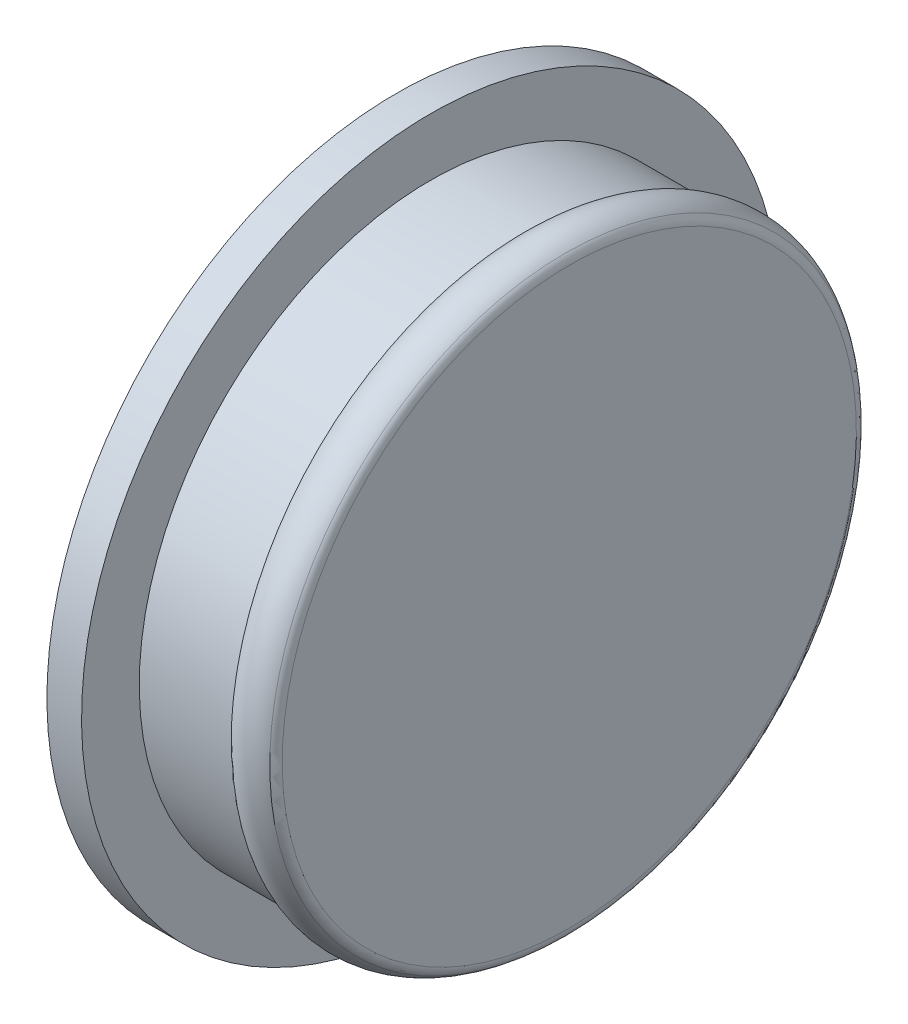
ISO-10303-21;
HEADER;
FILE_DESCRIPTION(('STEP AP214'),'2;1');
FILE_NAME('part.step','',(''),(''),'','','');
FILE_SCHEMA(('AUTOMOTIVE_DESIGN { 1 0 10303 214 1 1 1 1 }'));
ENDSEC;
DATA;
#1=APPLICATION_CONTEXT('core data for automotive mechanical design processes');
#2=APPLICATION_PROTOCOL_DEFINITION('international standard','automotive_design',2000,#1);
#3=PRODUCT_CONTEXT('',#1,'mechanical');
#4=PRODUCT('Part','Part','',(#3));
#5=PRODUCT_RELATED_PRODUCT_CATEGORY('part','',(#4));
#6=PRODUCT_DEFINITION_FORMATION('','',#4);
#7=PRODUCT_DEFINITION_CONTEXT('part definition',#1,'design');
#8=PRODUCT_DEFINITION('design','',#6,#7);
#9=PRODUCT_DEFINITION_SHAPE('','',#8);
#10=(LENGTH_UNIT() NAMED_UNIT(*) SI_UNIT(.MILLI.,.METRE.));
#11=(NAMED_UNIT(*) PLANE_ANGLE_UNIT() SI_UNIT($,.RADIAN.));
#12=(NAMED_UNIT(*) SI_UNIT($,.STERADIAN.) SOLID_ANGLE_UNIT());
#13=UNCERTAINTY_MEASURE_WITH_UNIT(LENGTH_MEASURE(1.E-05),#10,'distance_accuracy_value','');
#14=(GEOMETRIC_REPRESENTATION_CONTEXT(3) GLOBAL_UNCERTAINTY_ASSIGNED_CONTEXT((#13)) GLOBAL_UNIT_ASSIGNED_CONTEXT((#10,
#11,#12)) REPRESENTATION_CONTEXT('',''));
#15=CARTESIAN_POINT('',(0.,0.,0.));
#16=DIRECTION('',(0.,0.,1.));
#17=DIRECTION('',(1.,0.,0.));
#18=AXIS2_PLACEMENT_3D('',#15,#16,#17);
#19=CARTESIAN_POINT('',(-6.50330521457007,0.,0.));
#20=DIRECTION('',(-1.,0.,0.));
#21=DIRECTION('',(0.,-1.,0.));
#22=AXIS2_PLACEMENT_3D('',#19,#20,#21);
#23=CYLINDRICAL_SURFACE('',#22,7.6835);
#24=CARTESIAN_POINT('',(-1.27,0.,0.));
#25=DIRECTION('',(-1.,0.,0.));
#26=DIRECTION('',(0.,-1.,0.));
#27=AXIS2_PLACEMENT_3D('',#24,#25,#26);
#28=CIRCLE('',#27,7.6835);
#29=CARTESIAN_POINT('',(-1.27,-7.6835,0.));
#30=VERTEX_POINT('',#29);
#31=EDGE_CURVE('E61',#30,#30,#28,.T.);
#32=ORIENTED_EDGE('',*,*,#31,.F.);
#33=EDGE_LOOP('',(#32));
#34=FACE_BOUND('',#33,.T.);
#35=CARTESIAN_POINT('',(-0.507999999999998,0.,0.));
#36=DIRECTION('',(-1.,0.,0.));
#37=DIRECTION('',(0.,-1.,0.));
#38=AXIS2_PLACEMENT_3D('',#35,#36,#37);
#39=CIRCLE('',#38,7.6835);
#40=CARTESIAN_POINT('',(-0.507999999999998,-7.6835,0.));
#41=VERTEX_POINT('',#40);
#42=EDGE_CURVE('E70',#41,#41,#39,.T.);
#43=ORIENTED_EDGE('',*,*,#42,.T.);
#44=EDGE_LOOP('',(#43));
#45=FACE_BOUND('',#44,.T.);
#46=ADVANCED_FACE('F35',(#34,#45),#23,.T.);
#47=CARTESIAN_POINT('',(-1.27,5.1435,0.));
#48=DIRECTION('',(1.,0.,0.));
#49=DIRECTION('',(0.,1.,0.));
#50=AXIS2_PLACEMENT_3D('',#47,#48,#49);
#51=PLANE('',#50);
#52=CARTESIAN_POINT('',(-1.27,0.,0.));
#53=DIRECTION('',(1.,0.,0.));
#54=DIRECTION('',(0.,1.,0.));
#55=AXIS2_PLACEMENT_3D('',#52,#53,#54);
#56=CIRCLE('',#55,6.41350000000001);
#57=CARTESIAN_POINT('',(-1.27,6.41350000000001,0.));
#58=VERTEX_POINT('',#57);
#59=EDGE_CURVE('E46',#58,#58,#56,.T.);
#60=ORIENTED_EDGE('',*,*,#59,.T.);
#61=EDGE_LOOP('',(#60));
#62=FACE_BOUND('',#61,.T.);
#63=ORIENTED_EDGE('',*,*,#31,.T.);
#64=EDGE_LOOP('',(#63));
#65=FACE_BOUND('',#64,.T.);
#66=ADVANCED_FACE('F101',(#62,#65),#51,.F.);
#67=CARTESIAN_POINT('',(1.27,0.,0.));
#68=DIRECTION('',(1.,0.,0.));
#69=DIRECTION('',(0.,1.,0.));
#70=AXIS2_PLACEMENT_3D('',#67,#68,#69);
#71=PLANE('',#70);
#72=CARTESIAN_POINT('',(1.27,0.,0.));
#73=DIRECTION('',(1.,0.,0.));
#74=DIRECTION('',(0.,1.,0.));
#75=AXIS2_PLACEMENT_3D('',#72,#73,#74);
#76=CIRCLE('',#75,3.62997293740534);
#77=CARTESIAN_POINT('',(1.27,3.62997293740534,0.));
#78=VERTEX_POINT('',#77);
#79=EDGE_CURVE('E58',#78,#78,#76,.F.);
#80=ORIENTED_EDGE('',*,*,#79,.T.);
#81=EDGE_LOOP('',(#80));
#82=FACE_BOUND('',#81,.T.);
#83=ADVANCED_FACE('F97',(#82),#71,.F.);
#84=CARTESIAN_POINT('',(2.54,6.4135,0.));
#85=DIRECTION('',(-1.,0.,0.));
#86=DIRECTION('',(0.,-1.,0.));
#87=AXIS2_PLACEMENT_3D('',#84,#85,#86);
#88=PLANE('',#87);
#89=CARTESIAN_POINT('',(2.54,0.,0.));
#90=DIRECTION('',(-1.,0.,0.));
#91=DIRECTION('',(0.,-1.,0.));
#92=AXIS2_PLACEMENT_3D('',#89,#90,#91);
#93=CIRCLE('',#92,6.31648063314247);
#94=CARTESIAN_POINT('',(2.54,-6.31648063314247,0.));
#95=VERTEX_POINT('',#94);
#96=EDGE_CURVE('E50',#95,#95,#93,.F.);
#97=ORIENTED_EDGE('',*,*,#96,.T.);
#98=EDGE_LOOP('',(#97));
#99=FACE_BOUND('',#98,.T.);
#100=ADVANCED_FACE('F90',(#99),#88,.F.);
#101=CARTESIAN_POINT('',(2.032,0.,0.));
#102=DIRECTION('',(-1.,0.,0.));
#103=DIRECTION('',(0.,-1.,0.));
#104=AXIS2_PLACEMENT_3D('',#101,#102,#103);
#105=TOROIDAL_SURFACE('',#104,6.0325,0.635000000000001);
#106=CARTESIAN_POINT('',(2.45533333333334,0.,0.));
#107=DIRECTION('',(-1.,0.,0.));
#108=DIRECTION('',(0.,-1.,0.));
#109=AXIS2_PLACEMENT_3D('',#106,#107,#108);
#110=CIRCLE('',#109,6.50580105523746);
#111=CARTESIAN_POINT('',(2.45533333333334,-6.50580105523746,0.));
#112=VERTEX_POINT('',#111);
#113=EDGE_CURVE('E55',#112,#112,#110,.T.);
#114=ORIENTED_EDGE('',*,*,#113,.T.);
#115=EDGE_LOOP('',(#114));
#116=FACE_BOUND('',#115,.T.);
#117=CARTESIAN_POINT('',(1.524,0.,0.));
#118=DIRECTION('',(-1.,0.,0.));
#119=DIRECTION('',(0.,-1.,0.));
#120=AXIS2_PLACEMENT_3D('',#117,#118,#119);
#121=CIRCLE('',#120,6.4135);
#122=CARTESIAN_POINT('',(1.524,-6.4135,0.));
#123=VERTEX_POINT('',#122);
#124=EDGE_CURVE('E64',#123,#123,#121,.T.);
#125=ORIENTED_EDGE('',*,*,#124,.F.);
#126=EDGE_LOOP('',(#125));
#127=FACE_BOUND('',#126,.T.);
#128=ADVANCED_FACE('F85',(#116,#127),#105,.T.);
#129=CARTESIAN_POINT('',(-6.50330521457007,0.,0.));
#130=DIRECTION('',(-1.,0.,0.));
#131=DIRECTION('',(0.,-1.,0.));
#132=AXIS2_PLACEMENT_3D('',#129,#130,#131);
#133=CYLINDRICAL_SURFACE('',#132,6.4135);
#134=CARTESIAN_POINT('',(-0.507999999999998,0.,0.));
#135=DIRECTION('',(-1.,0.,0.));
#136=DIRECTION('',(0.,-1.,0.));
#137=AXIS2_PLACEMENT_3D('',#134,#135,#136);
#138=CIRCLE('',#137,6.4135);
#139=CARTESIAN_POINT('',(-0.507999999999998,-6.4135,0.));
#140=VERTEX_POINT('',#139);
#141=EDGE_CURVE('E67',#140,#140,#138,.T.);
#142=ORIENTED_EDGE('',*,*,#141,.F.);
#143=EDGE_LOOP('',(#142));
#144=FACE_BOUND('',#143,.T.);
#145=ORIENTED_EDGE('',*,*,#124,.T.);
#146=EDGE_LOOP('',(#145));
#147=FACE_BOUND('',#146,.T.);
#148=ADVANCED_FACE('F79',(#144,#147),#133,.T.);
#149=CARTESIAN_POINT('',(-0.507999999999998,7.6835,0.));
#150=DIRECTION('',(-1.,0.,0.));
#151=DIRECTION('',(0.,-1.,0.));
#152=AXIS2_PLACEMENT_3D('',#149,#150,#151);
#153=PLANE('',#152);
#154=ORIENTED_EDGE('',*,*,#42,.F.);
#155=EDGE_LOOP('',(#154));
#156=FACE_BOUND('',#155,.T.);
#157=ORIENTED_EDGE('',*,*,#141,.T.);
#158=EDGE_LOOP('',(#157));
#159=FACE_BOUND('',#158,.T.);
#160=ADVANCED_FACE('F75',(#156,#159),#153,.F.);
#161=CARTESIAN_POINT('',(1.27,0.,0.));
#162=DIRECTION('',(-1.,0.,0.));
#163=DIRECTION('',(0.,-1.,0.));
#164=AXIS2_PLACEMENT_3D('',#161,#162,#163);
#165=CONICAL_SURFACE('',#164,3.62997293740534,0.87266462599717);
#166=CARTESIAN_POINT('',(0.00712843713471505,0.,0.));
#167=DIRECTION('',(1.,0.,0.));
#168=DIRECTION('',(0.,1.,0.));
#169=AXIS2_PLACEMENT_3D('',#166,#167,#168);
#170=CIRCLE('',#169,5.13500465943512);
#171=CARTESIAN_POINT('',(0.0071284371347152,5.13500465943512,0.));
#172=VERTEX_POINT('',#171);
#173=EDGE_CURVE('E10',#172,#172,#170,.F.);
#174=ORIENTED_EDGE('',*,*,#173,.T.);
#175=EDGE_LOOP('',(#174));
#176=FACE_BOUND('',#175,.T.);
#177=ORIENTED_EDGE('',*,*,#79,.F.);
#178=EDGE_LOOP('',(#177));
#179=FACE_BOUND('',#178,.T.);
#180=ADVANCED_FACE('F78',(#176,#179),#165,.F.);
#181=CARTESIAN_POINT('',(2.286,0.,0.));
#182=DIRECTION('',(-1.,0.,0.));
#183=DIRECTION('',(0.,-1.,0.));
#184=AXIS2_PLACEMENT_3D('',#181,#182,#183);
#185=TOROIDAL_SURFACE('',#184,6.31648063314247,0.254);
#186=ORIENTED_EDGE('',*,*,#96,.F.);
#187=EDGE_LOOP('',(#186));
#188=FACE_BOUND('',#187,.T.);
#189=ORIENTED_EDGE('',*,*,#113,.F.);
#190=EDGE_LOOP('',(#189));
#191=FACE_BOUND('',#190,.T.);
#192=ADVANCED_FACE('F119',(#188,#191),#185,.T.);
#193=CARTESIAN_POINT('',(0.,0.,0.));
#194=DIRECTION('',(-1.,0.,0.));
#195=DIRECTION('',(0.,-1.,0.));
#196=AXIS2_PLACEMENT_3D('',#193,#194,#195);
#197=CONICAL_SURFACE('',#196,5.1435,0.785398163397451);
#198=CARTESIAN_POINT('',(-0.0078417289961219,0.,0.));
#199=DIRECTION('',(1.,0.,0.));
#200=DIRECTION('',(0.,1.,0.));
#201=AXIS2_PLACEMENT_3D('',#198,#199,#200);
#202=CIRCLE('',#201,5.15134172899612);
#203=CARTESIAN_POINT('',(-0.00784172899612175,5.15134172899612,0.));
#204=VERTEX_POINT('',#203);
#205=EDGE_CURVE('E42',#204,#204,#202,.T.);
#206=ORIENTED_EDGE('',*,*,#205,.T.);
#207=EDGE_LOOP('',(#206));
#208=FACE_BOUND('',#207,.T.);
#209=ORIENTED_EDGE('',*,*,#59,.F.);
#210=EDGE_LOOP('',(#209));
#211=FACE_BOUND('',#210,.T.);
#212=ADVANCED_FACE('F121',(#208,#211),#197,.F.);
#213=CARTESIAN_POINT('',(-0.187446851417506,0.,0.));
#214=DIRECTION('',(1.,0.,0.));
#215=DIRECTION('',(0.,1.,0.));
#216=AXIS2_PLACEMENT_3D('',#213,#214,#215);
#217=TOROIDAL_SURFACE('',#216,4.97173660657474,0.254);
#218=ORIENTED_EDGE('',*,*,#173,.F.);
#219=EDGE_LOOP('',(#218));
#220=FACE_BOUND('',#219,.T.);
#221=ORIENTED_EDGE('',*,*,#205,.F.);
#222=EDGE_LOOP('',(#221));
#223=FACE_BOUND('',#222,.T.);
#224=ADVANCED_FACE('F37',(#220,#223),#217,.F.);
#225=CLOSED_SHELL('',(#46,#66,#83,#100,#128,#148,#160,#180,#192,#212,#224));
#226=MANIFOLD_SOLID_BREP('B2',#225);
#227=ADVANCED_BREP_SHAPE_REPRESENTATION('',(#18,#226),#14);
#228=SHAPE_DEFINITION_REPRESENTATION(#9,#227);
ENDSEC;
END-ISO-10303-21;
